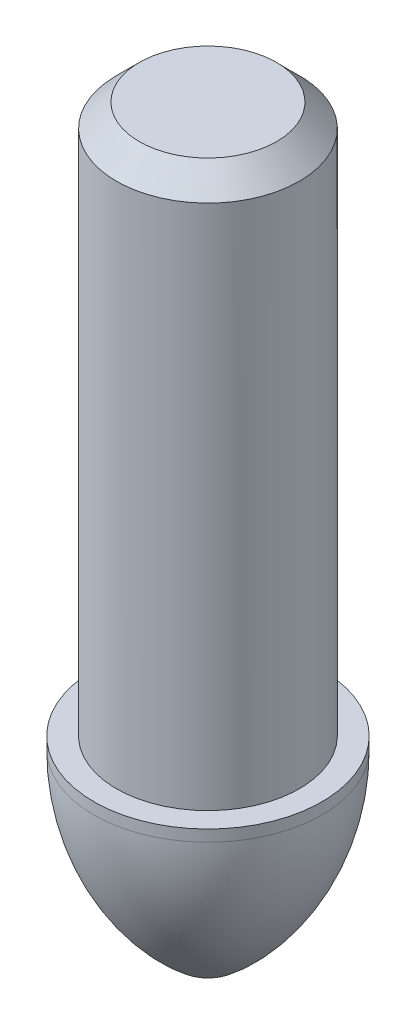
ISO-10303-21;
HEADER;
FILE_DESCRIPTION(('STEP AP214'),'2;1');
FILE_NAME('part.step','',(''),(''),'','','');
FILE_SCHEMA(('AUTOMOTIVE_DESIGN { 1 0 10303 214 1 1 1 1 }'));
ENDSEC;
DATA;
#1=APPLICATION_CONTEXT('core data for automotive mechanical design processes');
#2=APPLICATION_PROTOCOL_DEFINITION('international standard','automotive_design',2000,#1);
#3=PRODUCT_CONTEXT('',#1,'mechanical');
#4=PRODUCT('Part','Part','',(#3));
#5=PRODUCT_RELATED_PRODUCT_CATEGORY('part','',(#4));
#6=PRODUCT_DEFINITION_FORMATION('','',#4);
#7=PRODUCT_DEFINITION_CONTEXT('part definition',#1,'design');
#8=PRODUCT_DEFINITION('design','',#6,#7);
#9=PRODUCT_DEFINITION_SHAPE('','',#8);
#10=(LENGTH_UNIT() NAMED_UNIT(*) SI_UNIT(.MILLI.,.METRE.));
#11=(NAMED_UNIT(*) PLANE_ANGLE_UNIT() SI_UNIT($,.RADIAN.));
#12=(NAMED_UNIT(*) SI_UNIT($,.STERADIAN.) SOLID_ANGLE_UNIT());
#13=UNCERTAINTY_MEASURE_WITH_UNIT(LENGTH_MEASURE(1.E-05),#10,'distance_accuracy_value','');
#14=(GEOMETRIC_REPRESENTATION_CONTEXT(3) GLOBAL_UNCERTAINTY_ASSIGNED_CONTEXT((#13)) GLOBAL_UNIT_ASSIGNED_CONTEXT((#10,
#11,#12)) REPRESENTATION_CONTEXT('',''));
#15=CARTESIAN_POINT('',(0.,0.,0.));
#16=DIRECTION('',(0.,0.,1.));
#17=DIRECTION('',(1.,0.,0.));
#18=AXIS2_PLACEMENT_3D('',#15,#16,#17);
#19=CARTESIAN_POINT('',(0.,-30.7185749975376,0.));
#20=DIRECTION('',(0.,1.,0.));
#21=DIRECTION('',(-1.,0.,0.));
#22=AXIS2_PLACEMENT_3D('',#19,#20,#21);
#23=SPHERICAL_SURFACE('',#22,2.);
#24=CARTESIAN_POINT('',(0.,-32.2790706054517,0.));
#25=DIRECTION('',(0.,1.,0.));
#26=DIRECTION('',(-1.,0.,0.));
#27=AXIS2_PLACEMENT_3D('',#24,#25,#26);
#28=CIRCLE('',#27,1.25094102885822);
#29=CARTESIAN_POINT('',(-1.25094102885821,-32.2790706054517,0.));
#30=VERTEX_POINT('',#29);
#31=EDGE_CURVE('E61',#30,#30,#28,.T.);
#32=ORIENTED_EDGE('',*,*,#31,.F.);
#33=EDGE_LOOP('',(#32));
#34=FACE_BOUND('',#33,.T.);
#35=ADVANCED_FACE('F49',(#34),#23,.T.);
#36=CARTESIAN_POINT('',(0.,-24.5,0.));
#37=DIRECTION('',(0.,1.,0.));
#38=DIRECTION('',(-1.,0.,0.));
#39=AXIS2_PLACEMENT_3D('',#36,#37,#38);
#40=DEGENERATE_TOROIDAL_SURFACE('',#39,4.985,9.97,.F.);
#41=CARTESIAN_POINT('',(0.,-24.5,0.));
#42=DIRECTION('',(0.,1.,0.));
#43=DIRECTION('',(-1.,0.,0.));
#44=AXIS2_PLACEMENT_3D('',#41,#42,#43);
#45=CIRCLE('',#44,4.985);
#46=CARTESIAN_POINT('',(-4.985,-24.5,0.));
#47=VERTEX_POINT('',#46);
#48=EDGE_CURVE('E65',#47,#47,#45,.T.);
#49=ORIENTED_EDGE('',*,*,#48,.F.);
#50=EDGE_LOOP('',(#49));
#51=FACE_BOUND('',#50,.T.);
#52=ORIENTED_EDGE('',*,*,#31,.T.);
#53=EDGE_LOOP('',(#52));
#54=FACE_BOUND('',#53,.T.);
#55=ADVANCED_FACE('F88',(#51,#54),#40,.F.);
#56=CARTESIAN_POINT('',(0.,0.,0.));
#57=DIRECTION('',(0.,1.,0.));
#58=DIRECTION('',(-1.,0.,0.));
#59=AXIS2_PLACEMENT_3D('',#56,#57,#58);
#60=CYLINDRICAL_SURFACE('',#59,4.985);
#61=CARTESIAN_POINT('',(0.,-24.,0.));
#62=DIRECTION('',(0.,1.,0.));
#63=DIRECTION('',(-1.,0.,0.));
#64=AXIS2_PLACEMENT_3D('',#61,#62,#63);
#65=CIRCLE('',#64,4.985);
#66=CARTESIAN_POINT('',(-4.985,-24.,0.));
#67=VERTEX_POINT('',#66);
#68=EDGE_CURVE('E70',#67,#67,#65,.T.);
#69=ORIENTED_EDGE('',*,*,#68,.F.);
#70=EDGE_LOOP('',(#69));
#71=FACE_BOUND('',#70,.T.);
#72=ORIENTED_EDGE('',*,*,#48,.T.);
#73=EDGE_LOOP('',(#72));
#74=FACE_BOUND('',#73,.T.);
#75=ADVANCED_FACE('F82',(#71,#74),#60,.T.);
#76=CARTESIAN_POINT('',(4.,-24.,0.));
#77=DIRECTION('',(0.,-1.,0.));
#78=DIRECTION('',(1.,0.,0.));
#79=AXIS2_PLACEMENT_3D('',#76,#77,#78);
#80=PLANE('',#79);
#81=CARTESIAN_POINT('',(0.,-24.,0.));
#82=DIRECTION('',(0.,1.,0.));
#83=DIRECTION('',(-1.,0.,0.));
#84=AXIS2_PLACEMENT_3D('',#81,#82,#83);
#85=CIRCLE('',#84,4.);
#86=CARTESIAN_POINT('',(-4.,-24.,0.));
#87=VERTEX_POINT('',#86);
#88=EDGE_CURVE('E73',#87,#87,#85,.T.);
#89=ORIENTED_EDGE('',*,*,#88,.F.);
#90=EDGE_LOOP('',(#89));
#91=FACE_BOUND('',#90,.T.);
#92=ORIENTED_EDGE('',*,*,#68,.T.);
#93=EDGE_LOOP('',(#92));
#94=FACE_BOUND('',#93,.T.);
#95=ADVANCED_FACE('F79',(#91,#94),#80,.F.);
#96=CARTESIAN_POINT('',(0.,0.,0.));
#97=DIRECTION('',(0.,1.,0.));
#98=DIRECTION('',(-1.,0.,0.));
#99=AXIS2_PLACEMENT_3D('',#96,#97,#98);
#100=CYLINDRICAL_SURFACE('',#99,4.);
#101=CARTESIAN_POINT('',(0.,-1.00000000000001,0.));
#102=DIRECTION('',(0.,-1.,0.));
#103=DIRECTION('',(1.,0.,0.));
#104=AXIS2_PLACEMENT_3D('',#101,#102,#103);
#105=CIRCLE('',#104,4.);
#106=CARTESIAN_POINT('',(4.,-1.00000000000001,0.));
#107=VERTEX_POINT('',#106);
#108=EDGE_CURVE('E10',#107,#107,#105,.T.);
#109=ORIENTED_EDGE('',*,*,#108,.T.);
#110=EDGE_LOOP('',(#109));
#111=FACE_BOUND('',#110,.T.);
#112=ORIENTED_EDGE('',*,*,#88,.T.);
#113=EDGE_LOOP('',(#112));
#114=FACE_BOUND('',#113,.T.);
#115=ADVANCED_FACE('F77',(#111,#114),#100,.T.);
#116=CARTESIAN_POINT('',(0.,0.,0.));
#117=DIRECTION('',(0.,-1.,0.));
#118=DIRECTION('',(1.,0.,0.));
#119=AXIS2_PLACEMENT_3D('',#116,#117,#118);
#120=PLANE('',#119);
#121=CARTESIAN_POINT('',(0.,0.,0.));
#122=DIRECTION('',(0.,-1.,0.));
#123=DIRECTION('',(1.,0.,0.));
#124=AXIS2_PLACEMENT_3D('',#121,#122,#123);
#125=CIRCLE('',#124,3.);
#126=CARTESIAN_POINT('',(3.,0.,0.));
#127=VERTEX_POINT('',#126);
#128=EDGE_CURVE('E57',#127,#127,#125,.F.);
#129=ORIENTED_EDGE('',*,*,#128,.T.);
#130=EDGE_LOOP('',(#129));
#131=FACE_BOUND('',#130,.T.);
#132=ADVANCED_FACE('F103',(#131),#120,.F.);
#133=CARTESIAN_POINT('',(0.,0.,0.));
#134=DIRECTION('',(0.,-1.,0.));
#135=DIRECTION('',(1.,0.,0.));
#136=AXIS2_PLACEMENT_3D('',#133,#134,#135);
#137=CONICAL_SURFACE('',#136,3.,0.785398163397447);
#138=ORIENTED_EDGE('',*,*,#108,.F.);
#139=EDGE_LOOP('',(#138));
#140=FACE_BOUND('',#139,.T.);
#141=ORIENTED_EDGE('',*,*,#128,.F.);
#142=EDGE_LOOP('',(#141));
#143=FACE_BOUND('',#142,.T.);
#144=ADVANCED_FACE('F52',(#140,#143),#137,.T.);
#145=CLOSED_SHELL('',(#35,#55,#75,#95,#115,#132,#144));
#146=MANIFOLD_SOLID_BREP('B2',#145);
#147=ADVANCED_BREP_SHAPE_REPRESENTATION('',(#18,#146),#14);
#148=SHAPE_DEFINITION_REPRESENTATION(#9,#147);
ENDSEC;
END-ISO-10303-21;
